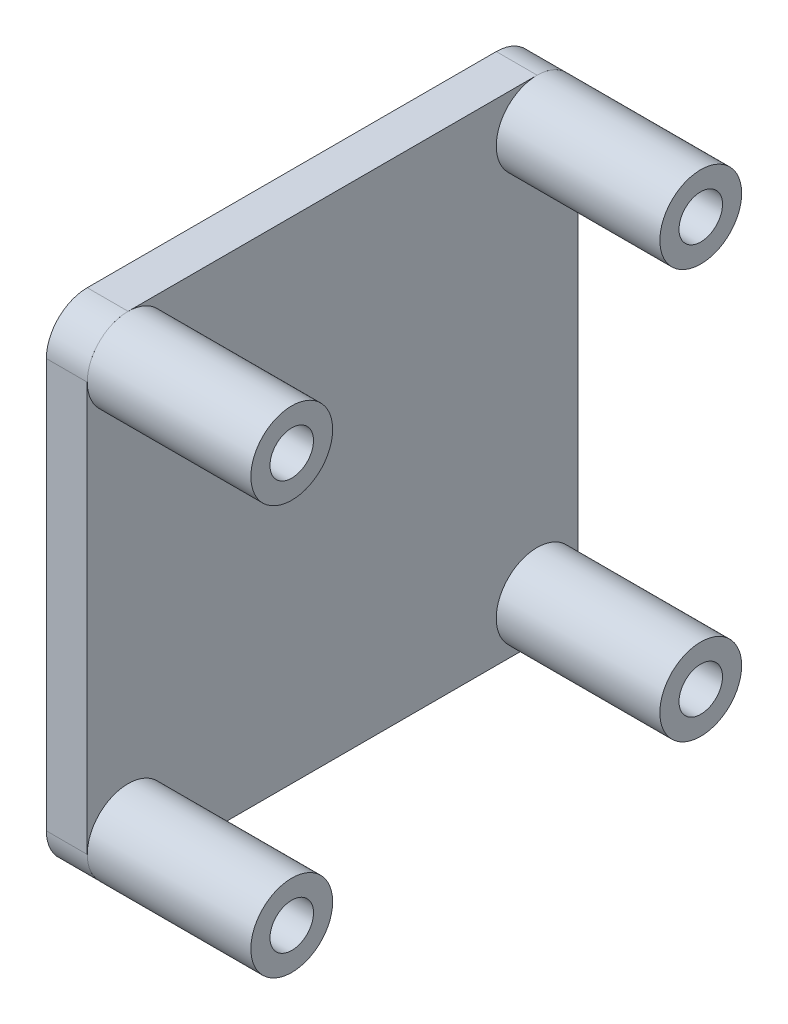
ISO-10303-21;
HEADER;
FILE_DESCRIPTION(('STEP AP214'),'2;1');
FILE_NAME('part.step','',(''),(''),'','','');
FILE_SCHEMA(('AUTOMOTIVE_DESIGN { 1 0 10303 214 1 1 1 1 }'));
ENDSEC;
DATA;
#1=APPLICATION_CONTEXT('core data for automotive mechanical design processes');
#2=APPLICATION_PROTOCOL_DEFINITION('international standard','automotive_design',2000,#1);
#3=PRODUCT_CONTEXT('',#1,'mechanical');
#4=PRODUCT('Part','Part','',(#3));
#5=PRODUCT_RELATED_PRODUCT_CATEGORY('part','',(#4));
#6=PRODUCT_DEFINITION_FORMATION('','',#4);
#7=PRODUCT_DEFINITION_CONTEXT('part definition',#1,'design');
#8=PRODUCT_DEFINITION('design','',#6,#7);
#9=PRODUCT_DEFINITION_SHAPE('','',#8);
#10=(LENGTH_UNIT() NAMED_UNIT(*) SI_UNIT(.MILLI.,.METRE.));
#11=(NAMED_UNIT(*) PLANE_ANGLE_UNIT() SI_UNIT($,.RADIAN.));
#12=(NAMED_UNIT(*) SI_UNIT($,.STERADIAN.) SOLID_ANGLE_UNIT());
#13=UNCERTAINTY_MEASURE_WITH_UNIT(LENGTH_MEASURE(1.E-05),#10,'distance_accuracy_value','');
#14=(GEOMETRIC_REPRESENTATION_CONTEXT(3) GLOBAL_UNCERTAINTY_ASSIGNED_CONTEXT((#13)) GLOBAL_UNIT_ASSIGNED_CONTEXT((#10,
#11,#12)) REPRESENTATION_CONTEXT('',''));
#15=CARTESIAN_POINT('',(0.,0.,0.));
#16=DIRECTION('',(0.,0.,1.));
#17=DIRECTION('',(1.,0.,0.));
#18=AXIS2_PLACEMENT_3D('',#15,#16,#17);
#19=CARTESIAN_POINT('',(31.75,31.75,31.75));
#20=DIRECTION('',(-1.,0.,0.));
#21=DIRECTION('',(0.,0.,1.));
#22=AXIS2_PLACEMENT_3D('',#19,#20,#21);
#23=CYLINDRICAL_SURFACE('',#22,6.35);
#24=CARTESIAN_POINT('',(31.75,31.75,31.75));
#25=DIRECTION('',(1.,0.,0.));
#26=DIRECTION('',(0.,0.,-1.));
#27=AXIS2_PLACEMENT_3D('',#24,#25,#26);
#28=CIRCLE('',#27,6.35);
#29=CARTESIAN_POINT('',(31.75,31.75,25.4));
#30=VERTEX_POINT('',#29);
#31=EDGE_CURVE('E11',#30,#30,#28,.T.);
#32=ORIENTED_EDGE('',*,*,#31,.F.);
#33=EDGE_LOOP('',(#32));
#34=FACE_BOUND('',#33,.T.);
#35=CARTESIAN_POINT('',(6.35,31.75,31.75));
#36=DIRECTION('',(1.,0.,0.));
#37=DIRECTION('',(0.,0.,-1.));
#38=AXIS2_PLACEMENT_3D('',#35,#36,#37);
#39=CIRCLE('',#38,6.35);
#40=CARTESIAN_POINT('',(6.35,31.75,25.4));
#41=VERTEX_POINT('',#40);
#42=EDGE_CURVE('E41',#41,#41,#39,.T.);
#43=ORIENTED_EDGE('',*,*,#42,.T.);
#44=EDGE_LOOP('',(#43));
#45=FACE_BOUND('',#44,.T.);
#46=ADVANCED_FACE('F38',(#34,#45),#23,.T.);
#47=CARTESIAN_POINT('',(31.75,31.75,31.75));
#48=DIRECTION('',(1.,0.,0.));
#49=DIRECTION('',(0.,0.,-1.));
#50=AXIS2_PLACEMENT_3D('',#47,#48,#49);
#51=PLANE('',#50);
#52=CARTESIAN_POINT('',(31.75,31.75,31.75));
#53=DIRECTION('',(1.,0.,0.));
#54=DIRECTION('',(0.,0.,-1.));
#55=AXIS2_PLACEMENT_3D('',#52,#53,#54);
#56=CIRCLE('',#55,3.3782);
#57=CARTESIAN_POINT('',(31.75,31.75,28.3718));
#58=VERTEX_POINT('',#57);
#59=EDGE_CURVE('E52',#58,#58,#56,.T.);
#60=ORIENTED_EDGE('',*,*,#59,.F.);
#61=EDGE_LOOP('',(#60));
#62=FACE_BOUND('',#61,.T.);
#63=ORIENTED_EDGE('',*,*,#31,.T.);
#64=EDGE_LOOP('',(#63));
#65=FACE_BOUND('',#64,.T.);
#66=ADVANCED_FACE('F59',(#62,#65),#51,.T.);
#67=CARTESIAN_POINT('',(6.35,31.75,31.75));
#68=DIRECTION('',(1.,0.,0.));
#69=DIRECTION('',(0.,0.,-1.));
#70=AXIS2_PLACEMENT_3D('',#67,#68,#69);
#71=PLANE('',#70);
#72=CARTESIAN_POINT('',(6.35,31.75,31.75));
#73=DIRECTION('',(1.,0.,0.));
#74=DIRECTION('',(0.,0.,-1.));
#75=AXIS2_PLACEMENT_3D('',#72,#73,#74);
#76=CIRCLE('',#75,3.37819999999999);
#77=CARTESIAN_POINT('',(6.35,31.75,28.3718));
#78=VERTEX_POINT('',#77);
#79=EDGE_CURVE('E48',#78,#78,#76,.T.);
#80=ORIENTED_EDGE('',*,*,#79,.T.);
#81=EDGE_LOOP('',(#80));
#82=FACE_BOUND('',#81,.T.);
#83=ORIENTED_EDGE('',*,*,#42,.F.);
#84=EDGE_LOOP('',(#83));
#85=FACE_BOUND('',#84,.T.);
#86=ADVANCED_FACE('F61',(#82,#85),#71,.F.);
#87=CARTESIAN_POINT('',(31.75,31.75,31.75));
#88=DIRECTION('',(1.,0.,0.));
#89=DIRECTION('',(0.,0.,-1.));
#90=AXIS2_PLACEMENT_3D('',#87,#88,#89);
#91=CYLINDRICAL_SURFACE('',#90,3.37819999999999);
#92=ORIENTED_EDGE('',*,*,#59,.T.);
#93=EDGE_LOOP('',(#92));
#94=FACE_BOUND('',#93,.T.);
#95=ORIENTED_EDGE('',*,*,#79,.F.);
#96=EDGE_LOOP('',(#95));
#97=FACE_BOUND('',#96,.T.);
#98=ADVANCED_FACE('F56',(#94,#97),#91,.F.);
#99=CLOSED_SHELL('',(#46,#66,#86,#98));
#100=MANIFOLD_SOLID_BREP('B2',#99);
#101=CARTESIAN_POINT('',(31.75,-31.75,31.75));
#102=DIRECTION('',(-1.,0.,0.));
#103=DIRECTION('',(0.,0.,1.));
#104=AXIS2_PLACEMENT_3D('',#101,#102,#103);
#105=CYLINDRICAL_SURFACE('',#104,6.35);
#106=CARTESIAN_POINT('',(31.75,-31.75,31.75));
#107=DIRECTION('',(1.,0.,0.));
#108=DIRECTION('',(0.,0.,-1.));
#109=AXIS2_PLACEMENT_3D('',#106,#107,#108);
#110=CIRCLE('',#109,6.35);
#111=CARTESIAN_POINT('',(31.75,-31.75,25.4));
#112=VERTEX_POINT('',#111);
#113=EDGE_CURVE('E37',#112,#112,#110,.T.);
#114=ORIENTED_EDGE('',*,*,#113,.F.);
#115=EDGE_LOOP('',(#114));
#116=FACE_BOUND('',#115,.T.);
#117=CARTESIAN_POINT('',(6.35,-31.75,31.75));
#118=DIRECTION('',(1.,0.,0.));
#119=DIRECTION('',(0.,0.,-1.));
#120=AXIS2_PLACEMENT_3D('',#117,#118,#119);
#121=CIRCLE('',#120,6.35);
#122=CARTESIAN_POINT('',(6.35,-31.75,25.4));
#123=VERTEX_POINT('',#122);
#124=EDGE_CURVE('E111',#123,#123,#121,.T.);
#125=ORIENTED_EDGE('',*,*,#124,.T.);
#126=EDGE_LOOP('',(#125));
#127=FACE_BOUND('',#126,.T.);
#128=ADVANCED_FACE('F108',(#116,#127),#105,.T.);
#129=CARTESIAN_POINT('',(31.75,-31.75,31.75));
#130=DIRECTION('',(1.,0.,0.));
#131=DIRECTION('',(0.,0.,-1.));
#132=AXIS2_PLACEMENT_3D('',#129,#130,#131);
#133=PLANE('',#132);
#134=CARTESIAN_POINT('',(31.75,-31.75,31.75));
#135=DIRECTION('',(1.,0.,0.));
#136=DIRECTION('',(0.,0.,-1.));
#137=AXIS2_PLACEMENT_3D('',#134,#135,#136);
#138=CIRCLE('',#137,3.3782);
#139=CARTESIAN_POINT('',(31.75,-31.75,28.3718));
#140=VERTEX_POINT('',#139);
#141=EDGE_CURVE('E122',#140,#140,#138,.T.);
#142=ORIENTED_EDGE('',*,*,#141,.F.);
#143=EDGE_LOOP('',(#142));
#144=FACE_BOUND('',#143,.T.);
#145=ORIENTED_EDGE('',*,*,#113,.T.);
#146=EDGE_LOOP('',(#145));
#147=FACE_BOUND('',#146,.T.);
#148=ADVANCED_FACE('F129',(#144,#147),#133,.T.);
#149=CARTESIAN_POINT('',(6.35,-31.75,31.75));
#150=DIRECTION('',(1.,0.,0.));
#151=DIRECTION('',(0.,0.,-1.));
#152=AXIS2_PLACEMENT_3D('',#149,#150,#151);
#153=PLANE('',#152);
#154=CARTESIAN_POINT('',(6.35,-31.75,31.75));
#155=DIRECTION('',(1.,0.,0.));
#156=DIRECTION('',(0.,0.,-1.));
#157=AXIS2_PLACEMENT_3D('',#154,#155,#156);
#158=CIRCLE('',#157,3.37819999999999);
#159=CARTESIAN_POINT('',(6.35,-31.75,28.3718));
#160=VERTEX_POINT('',#159);
#161=EDGE_CURVE('E118',#160,#160,#158,.T.);
#162=ORIENTED_EDGE('',*,*,#161,.T.);
#163=EDGE_LOOP('',(#162));
#164=FACE_BOUND('',#163,.T.);
#165=ORIENTED_EDGE('',*,*,#124,.F.);
#166=EDGE_LOOP('',(#165));
#167=FACE_BOUND('',#166,.T.);
#168=ADVANCED_FACE('F131',(#164,#167),#153,.F.);
#169=CARTESIAN_POINT('',(31.75,-31.75,31.75));
#170=DIRECTION('',(1.,0.,0.));
#171=DIRECTION('',(0.,0.,-1.));
#172=AXIS2_PLACEMENT_3D('',#169,#170,#171);
#173=CYLINDRICAL_SURFACE('',#172,3.37819999999999);
#174=ORIENTED_EDGE('',*,*,#141,.T.);
#175=EDGE_LOOP('',(#174));
#176=FACE_BOUND('',#175,.T.);
#177=ORIENTED_EDGE('',*,*,#161,.F.);
#178=EDGE_LOOP('',(#177));
#179=FACE_BOUND('',#178,.T.);
#180=ADVANCED_FACE('F126',(#176,#179),#173,.F.);
#181=CLOSED_SHELL('',(#128,#148,#168,#180));
#182=MANIFOLD_SOLID_BREP('B6',#181);
#183=CARTESIAN_POINT('',(31.75,-31.75,-31.75));
#184=DIRECTION('',(-1.,0.,0.));
#185=DIRECTION('',(0.,0.,1.));
#186=AXIS2_PLACEMENT_3D('',#183,#184,#185);
#187=CYLINDRICAL_SURFACE('',#186,6.35);
#188=CARTESIAN_POINT('',(31.75,-31.75,-31.75));
#189=DIRECTION('',(1.,0.,0.));
#190=DIRECTION('',(0.,0.,-1.));
#191=AXIS2_PLACEMENT_3D('',#188,#189,#190);
#192=CIRCLE('',#191,6.35);
#193=CARTESIAN_POINT('',(31.75,-31.75,-38.1));
#194=VERTEX_POINT('',#193);
#195=EDGE_CURVE('E107',#194,#194,#192,.T.);
#196=ORIENTED_EDGE('',*,*,#195,.F.);
#197=EDGE_LOOP('',(#196));
#198=FACE_BOUND('',#197,.T.);
#199=CARTESIAN_POINT('',(6.35,-31.75,-31.75));
#200=DIRECTION('',(1.,0.,0.));
#201=DIRECTION('',(0.,0.,-1.));
#202=AXIS2_PLACEMENT_3D('',#199,#200,#201);
#203=CIRCLE('',#202,6.35);
#204=CARTESIAN_POINT('',(6.35,-31.75,-38.1));
#205=VERTEX_POINT('',#204);
#206=EDGE_CURVE('E185',#205,#205,#203,.T.);
#207=ORIENTED_EDGE('',*,*,#206,.T.);
#208=EDGE_LOOP('',(#207));
#209=FACE_BOUND('',#208,.T.);
#210=ADVANCED_FACE('F178',(#198,#209),#187,.T.);
#211=CARTESIAN_POINT('',(31.75,-31.75,-31.75));
#212=DIRECTION('',(1.,0.,0.));
#213=DIRECTION('',(0.,0.,-1.));
#214=AXIS2_PLACEMENT_3D('',#211,#212,#213);
#215=PLANE('',#214);
#216=CARTESIAN_POINT('',(31.75,-31.75,-31.75));
#217=DIRECTION('',(1.,0.,0.));
#218=DIRECTION('',(0.,0.,-1.));
#219=AXIS2_PLACEMENT_3D('',#216,#217,#218);
#220=CIRCLE('',#219,3.3782);
#221=CARTESIAN_POINT('',(31.75,-31.75,-35.1282));
#222=VERTEX_POINT('',#221);
#223=EDGE_CURVE('E191',#222,#222,#220,.T.);
#224=ORIENTED_EDGE('',*,*,#223,.F.);
#225=EDGE_LOOP('',(#224));
#226=FACE_BOUND('',#225,.T.);
#227=ORIENTED_EDGE('',*,*,#195,.T.);
#228=EDGE_LOOP('',(#227));
#229=FACE_BOUND('',#228,.T.);
#230=ADVANCED_FACE('F207',(#226,#229),#215,.T.);
#231=CARTESIAN_POINT('',(6.35,-31.75,-31.75));
#232=DIRECTION('',(1.,0.,0.));
#233=DIRECTION('',(0.,0.,-1.));
#234=AXIS2_PLACEMENT_3D('',#231,#232,#233);
#235=PLANE('',#234);
#236=CARTESIAN_POINT('',(6.35,-31.75,-31.75));
#237=DIRECTION('',(1.,0.,0.));
#238=DIRECTION('',(0.,0.,-1.));
#239=AXIS2_PLACEMENT_3D('',#236,#237,#238);
#240=CIRCLE('',#239,3.37819999999999);
#241=CARTESIAN_POINT('',(6.35,-31.75,-35.1282));
#242=VERTEX_POINT('',#241);
#243=EDGE_CURVE('E181',#242,#242,#240,.T.);
#244=ORIENTED_EDGE('',*,*,#243,.T.);
#245=EDGE_LOOP('',(#244));
#246=FACE_BOUND('',#245,.T.);
#247=ORIENTED_EDGE('',*,*,#206,.F.);
#248=EDGE_LOOP('',(#247));
#249=FACE_BOUND('',#248,.T.);
#250=ADVANCED_FACE('F198',(#246,#249),#235,.F.);
#251=CARTESIAN_POINT('',(31.75,-31.75,-31.75));
#252=DIRECTION('',(1.,0.,0.));
#253=DIRECTION('',(0.,0.,-1.));
#254=AXIS2_PLACEMENT_3D('',#251,#252,#253);
#255=CYLINDRICAL_SURFACE('',#254,3.37819999999999);
#256=ORIENTED_EDGE('',*,*,#223,.T.);
#257=EDGE_LOOP('',(#256));
#258=FACE_BOUND('',#257,.T.);
#259=ORIENTED_EDGE('',*,*,#243,.F.);
#260=EDGE_LOOP('',(#259));
#261=FACE_BOUND('',#260,.T.);
#262=ADVANCED_FACE('F201',(#258,#261),#255,.F.);
#263=CLOSED_SHELL('',(#210,#230,#250,#262));
#264=MANIFOLD_SOLID_BREP('B32',#263);
#265=CARTESIAN_POINT('',(31.75,31.75,-31.75));
#266=DIRECTION('',(-1.,0.,0.));
#267=DIRECTION('',(0.,0.,1.));
#268=AXIS2_PLACEMENT_3D('',#265,#266,#267);
#269=CYLINDRICAL_SURFACE('',#268,6.35);
#270=CARTESIAN_POINT('',(31.75,31.75,-31.75));
#271=DIRECTION('',(1.,0.,0.));
#272=DIRECTION('',(0.,0.,-1.));
#273=AXIS2_PLACEMENT_3D('',#270,#271,#272);
#274=CIRCLE('',#273,6.35);
#275=CARTESIAN_POINT('',(31.75,31.75,-38.1));
#276=VERTEX_POINT('',#275);
#277=EDGE_CURVE('E177',#276,#276,#274,.T.);
#278=ORIENTED_EDGE('',*,*,#277,.F.);
#279=EDGE_LOOP('',(#278));
#280=FACE_BOUND('',#279,.T.);
#281=CARTESIAN_POINT('',(6.35,31.75,-31.75));
#282=DIRECTION('',(1.,0.,0.));
#283=DIRECTION('',(0.,0.,-1.));
#284=AXIS2_PLACEMENT_3D('',#281,#282,#283);
#285=CIRCLE('',#284,6.35);
#286=CARTESIAN_POINT('',(6.35,31.75,-38.1));
#287=VERTEX_POINT('',#286);
#288=EDGE_CURVE('E252',#287,#287,#285,.T.);
#289=ORIENTED_EDGE('',*,*,#288,.T.);
#290=EDGE_LOOP('',(#289));
#291=FACE_BOUND('',#290,.T.);
#292=ADVANCED_FACE('F249',(#280,#291),#269,.T.);
#293=CARTESIAN_POINT('',(31.75,31.75,-31.75));
#294=DIRECTION('',(1.,0.,0.));
#295=DIRECTION('',(0.,0.,-1.));
#296=AXIS2_PLACEMENT_3D('',#293,#294,#295);
#297=PLANE('',#296);
#298=CARTESIAN_POINT('',(31.75,31.75,-31.75));
#299=DIRECTION('',(1.,0.,0.));
#300=DIRECTION('',(0.,0.,-1.));
#301=AXIS2_PLACEMENT_3D('',#298,#299,#300);
#302=CIRCLE('',#301,3.3782);
#303=CARTESIAN_POINT('',(31.75,31.75,-35.1282));
#304=VERTEX_POINT('',#303);
#305=EDGE_CURVE('E263',#304,#304,#302,.T.);
#306=ORIENTED_EDGE('',*,*,#305,.F.);
#307=EDGE_LOOP('',(#306));
#308=FACE_BOUND('',#307,.T.);
#309=ORIENTED_EDGE('',*,*,#277,.T.);
#310=EDGE_LOOP('',(#309));
#311=FACE_BOUND('',#310,.T.);
#312=ADVANCED_FACE('F270',(#308,#311),#297,.T.);
#313=CARTESIAN_POINT('',(6.35,31.75,-31.75));
#314=DIRECTION('',(1.,0.,0.));
#315=DIRECTION('',(0.,0.,-1.));
#316=AXIS2_PLACEMENT_3D('',#313,#314,#315);
#317=PLANE('',#316);
#318=CARTESIAN_POINT('',(6.35,31.75,-31.75));
#319=DIRECTION('',(1.,0.,0.));
#320=DIRECTION('',(0.,0.,-1.));
#321=AXIS2_PLACEMENT_3D('',#318,#319,#320);
#322=CIRCLE('',#321,3.37819999999999);
#323=CARTESIAN_POINT('',(6.35,31.75,-35.1282));
#324=VERTEX_POINT('',#323);
#325=EDGE_CURVE('E259',#324,#324,#322,.T.);
#326=ORIENTED_EDGE('',*,*,#325,.T.);
#327=EDGE_LOOP('',(#326));
#328=FACE_BOUND('',#327,.T.);
#329=ORIENTED_EDGE('',*,*,#288,.F.);
#330=EDGE_LOOP('',(#329));
#331=FACE_BOUND('',#330,.T.);
#332=ADVANCED_FACE('F272',(#328,#331),#317,.F.);
#333=CARTESIAN_POINT('',(31.75,31.75,-31.75));
#334=DIRECTION('',(1.,0.,0.));
#335=DIRECTION('',(0.,0.,-1.));
#336=AXIS2_PLACEMENT_3D('',#333,#334,#335);
#337=CYLINDRICAL_SURFACE('',#336,3.37819999999999);
#338=ORIENTED_EDGE('',*,*,#305,.T.);
#339=EDGE_LOOP('',(#338));
#340=FACE_BOUND('',#339,.T.);
#341=ORIENTED_EDGE('',*,*,#325,.F.);
#342=EDGE_LOOP('',(#341));
#343=FACE_BOUND('',#342,.T.);
#344=ADVANCED_FACE('F267',(#340,#343),#337,.F.);
#345=CLOSED_SHELL('',(#292,#312,#332,#344));
#346=MANIFOLD_SOLID_BREP('B102',#345);
#347=CARTESIAN_POINT('',(6.35,-38.1,38.1));
#348=DIRECTION('',(0.,0.,-1.));
#349=DIRECTION('',(-1.,0.,0.));
#350=AXIS2_PLACEMENT_3D('',#347,#348,#349);
#351=PLANE('',#350);
#352=DIRECTION('',(0.,-1.,0.));
#353=VECTOR('',#352,1.);
#354=CARTESIAN_POINT('',(0.,-38.1,38.1));
#355=LINE('',#354,#353);
#356=CARTESIAN_POINT('',(0.,31.75,38.1));
#357=VERTEX_POINT('',#356);
#358=CARTESIAN_POINT('',(0.,-31.75,38.1));
#359=VERTEX_POINT('',#358);
#360=EDGE_CURVE('E407',#357,#359,#355,.T.);
#361=ORIENTED_EDGE('',*,*,#360,.T.);
#362=DIRECTION('',(-1.,0.,0.));
#363=VECTOR('',#362,1.);
#364=CARTESIAN_POINT('',(6.35,-31.75,38.1));
#365=LINE('',#364,#363);
#366=CARTESIAN_POINT('',(6.35,-31.75,38.1));
#367=VERTEX_POINT('',#366);
#368=EDGE_CURVE('E247',#359,#367,#365,.F.);
#369=ORIENTED_EDGE('',*,*,#368,.T.);
#370=DIRECTION('',(0.,-1.,0.));
#371=VECTOR('',#370,1.);
#372=CARTESIAN_POINT('',(6.35,-38.1,38.1));
#373=LINE('',#372,#371);
#374=CARTESIAN_POINT('',(6.35,31.75,38.1));
#375=VERTEX_POINT('',#374);
#376=EDGE_CURVE('E405',#375,#367,#373,.T.);
#377=ORIENTED_EDGE('',*,*,#376,.F.);
#378=DIRECTION('',(-1.,0.,0.));
#379=VECTOR('',#378,1.);
#380=CARTESIAN_POINT('',(6.35,31.75,38.1));
#381=LINE('',#380,#379);
#382=EDGE_CURVE('E319',#375,#357,#381,.T.);
#383=ORIENTED_EDGE('',*,*,#382,.T.);
#384=EDGE_LOOP('',(#361,#369,#377,#383));
#385=FACE_BOUND('',#384,.T.);
#386=ADVANCED_FACE('F311',(#385),#351,.F.);
#387=CARTESIAN_POINT('',(6.35,-38.1,-38.1));
#388=DIRECTION('',(0.,1.,0.));
#389=DIRECTION('',(0.,0.,1.));
#390=AXIS2_PLACEMENT_3D('',#387,#388,#389);
#391=PLANE('',#390);
#392=DIRECTION('',(0.,0.,-1.));
#393=VECTOR('',#392,1.);
#394=CARTESIAN_POINT('',(0.,-38.1,-38.1));
#395=LINE('',#394,#393);
#396=CARTESIAN_POINT('',(0.,-38.1,31.75));
#397=VERTEX_POINT('',#396);
#398=CARTESIAN_POINT('',(0.,-38.1,-31.75));
#399=VERTEX_POINT('',#398);
#400=EDGE_CURVE('E403',#397,#399,#395,.T.);
#401=ORIENTED_EDGE('',*,*,#400,.T.);
#402=DIRECTION('',(-1.,0.,0.));
#403=VECTOR('',#402,1.);
#404=CARTESIAN_POINT('',(6.35,-38.1,-31.75));
#405=LINE('',#404,#403);
#406=CARTESIAN_POINT('',(6.35,-38.1,-31.75));
#407=VERTEX_POINT('',#406);
#408=EDGE_CURVE('E382',#399,#407,#405,.F.);
#409=ORIENTED_EDGE('',*,*,#408,.T.);
#410=DIRECTION('',(0.,0.,-1.));
#411=VECTOR('',#410,1.);
#412=CARTESIAN_POINT('',(6.35,-38.1,-38.1));
#413=LINE('',#412,#411);
#414=CARTESIAN_POINT('',(6.35,-38.1,31.75));
#415=VERTEX_POINT('',#414);
#416=EDGE_CURVE('E447',#415,#407,#413,.T.);
#417=ORIENTED_EDGE('',*,*,#416,.F.);
#418=DIRECTION('',(-1.,0.,0.));
#419=VECTOR('',#418,1.);
#420=CARTESIAN_POINT('',(6.35,-38.1,31.75));
#421=LINE('',#420,#419);
#422=EDGE_CURVE('E387',#415,#397,#421,.T.);
#423=ORIENTED_EDGE('',*,*,#422,.T.);
#424=EDGE_LOOP('',(#401,#409,#417,#423));
#425=FACE_BOUND('',#424,.T.);
#426=ADVANCED_FACE('F486',(#425),#391,.F.);
#427=CARTESIAN_POINT('',(6.35,-38.1,-38.1));
#428=DIRECTION('',(0.,0.,1.));
#429=DIRECTION('',(1.,0.,0.));
#430=AXIS2_PLACEMENT_3D('',#427,#428,#429);
#431=PLANE('',#430);
#432=DIRECTION('',(0.,1.,0.));
#433=VECTOR('',#432,1.);
#434=CARTESIAN_POINT('',(6.35,-38.1,-38.1));
#435=LINE('',#434,#433);
#436=CARTESIAN_POINT('',(6.35,-31.75,-38.1));
#437=VERTEX_POINT('',#436);
#438=CARTESIAN_POINT('',(6.35,31.75,-38.1));
#439=VERTEX_POINT('',#438);
#440=EDGE_CURVE('E396',#437,#439,#435,.T.);
#441=ORIENTED_EDGE('',*,*,#440,.F.);
#442=DIRECTION('',(-1.,0.,0.));
#443=VECTOR('',#442,1.);
#444=CARTESIAN_POINT('',(6.35,-31.75,-38.1));
#445=LINE('',#444,#443);
#446=CARTESIAN_POINT('',(0.,-31.75,-38.1));
#447=VERTEX_POINT('',#446);
#448=EDGE_CURVE('E381',#437,#447,#445,.T.);
#449=ORIENTED_EDGE('',*,*,#448,.T.);
#450=DIRECTION('',(0.,1.,0.));
#451=VECTOR('',#450,1.);
#452=CARTESIAN_POINT('',(0.,-38.1,-38.1));
#453=LINE('',#452,#451);
#454=CARTESIAN_POINT('',(0.,31.75,-38.1));
#455=VERTEX_POINT('',#454);
#456=EDGE_CURVE('E394',#447,#455,#453,.T.);
#457=ORIENTED_EDGE('',*,*,#456,.T.);
#458=DIRECTION('',(-1.,0.,0.));
#459=VECTOR('',#458,1.);
#460=CARTESIAN_POINT('',(6.35,31.75,-38.1));
#461=LINE('',#460,#459);
#462=EDGE_CURVE('E398',#455,#439,#461,.F.);
#463=ORIENTED_EDGE('',*,*,#462,.T.);
#464=EDGE_LOOP('',(#441,#449,#457,#463));
#465=FACE_BOUND('',#464,.T.);
#466=ADVANCED_FACE('F393',(#465),#431,.F.);
#467=CARTESIAN_POINT('',(6.35,38.1,-38.1));
#468=DIRECTION('',(0.,-1.,0.));
#469=DIRECTION('',(0.,0.,-1.));
#470=AXIS2_PLACEMENT_3D('',#467,#468,#469);
#471=PLANE('',#470);
#472=DIRECTION('',(0.,0.,1.));
#473=VECTOR('',#472,1.);
#474=CARTESIAN_POINT('',(6.35,38.1,-38.1));
#475=LINE('',#474,#473);
#476=CARTESIAN_POINT('',(6.35,38.1,-31.75));
#477=VERTEX_POINT('',#476);
#478=CARTESIAN_POINT('',(6.35,38.1,31.75));
#479=VERTEX_POINT('',#478);
#480=EDGE_CURVE('E411',#477,#479,#475,.T.);
#481=ORIENTED_EDGE('',*,*,#480,.F.);
#482=DIRECTION('',(-1.,0.,0.));
#483=VECTOR('',#482,1.);
#484=CARTESIAN_POINT('',(6.35,38.1,-31.75));
#485=LINE('',#484,#483);
#486=CARTESIAN_POINT('',(0.,38.1,-31.75));
#487=VERTEX_POINT('',#486);
#488=EDGE_CURVE('E428',#477,#487,#485,.T.);
#489=ORIENTED_EDGE('',*,*,#488,.T.);
#490=DIRECTION('',(0.,0.,1.));
#491=VECTOR('',#490,1.);
#492=CARTESIAN_POINT('',(0.,38.1,-38.1));
#493=LINE('',#492,#491);
#494=CARTESIAN_POINT('',(0.,38.1,31.75));
#495=VERTEX_POINT('',#494);
#496=EDGE_CURVE('E402',#487,#495,#493,.T.);
#497=ORIENTED_EDGE('',*,*,#496,.T.);
#498=DIRECTION('',(-1.,0.,0.));
#499=VECTOR('',#498,1.);
#500=CARTESIAN_POINT('',(6.35,38.1,31.75));
#501=LINE('',#500,#499);
#502=EDGE_CURVE('E326',#495,#479,#501,.F.);
#503=ORIENTED_EDGE('',*,*,#502,.T.);
#504=EDGE_LOOP('',(#481,#489,#497,#503));
#505=FACE_BOUND('',#504,.T.);
#506=ADVANCED_FACE('F512',(#505),#471,.F.);
#507=CARTESIAN_POINT('',(6.35,38.1,38.1));
#508=DIRECTION('',(1.,0.,0.));
#509=DIRECTION('',(0.,0.,-1.));
#510=AXIS2_PLACEMENT_3D('',#507,#508,#509);
#511=PLANE('',#510);
#512=CARTESIAN_POINT('',(6.35,31.75,-31.75));
#513=DIRECTION('',(1.,0.,0.));
#514=DIRECTION('',(0.,0.,-1.));
#515=AXIS2_PLACEMENT_3D('',#512,#513,#514);
#516=CIRCLE('',#515,3.37819999999999);
#517=CARTESIAN_POINT('',(6.35,31.75,-35.1282));
#518=VERTEX_POINT('',#517);
#519=EDGE_CURVE('E465',#518,#518,#516,.T.);
#520=ORIENTED_EDGE('',*,*,#519,.F.);
#521=EDGE_LOOP('',(#520));
#522=FACE_BOUND('',#521,.T.);
#523=CARTESIAN_POINT('',(6.35,-31.75,31.75));
#524=DIRECTION('',(1.,0.,0.));
#525=DIRECTION('',(0.,0.,-1.));
#526=AXIS2_PLACEMENT_3D('',#523,#524,#525);
#527=CIRCLE('',#526,3.37819999999999);
#528=CARTESIAN_POINT('',(6.35,-31.75,28.3718));
#529=VERTEX_POINT('',#528);
#530=EDGE_CURVE('E459',#529,#529,#527,.T.);
#531=ORIENTED_EDGE('',*,*,#530,.F.);
#532=EDGE_LOOP('',(#531));
#533=FACE_BOUND('',#532,.T.);
#534=CARTESIAN_POINT('',(6.35,31.75,31.75));
#535=DIRECTION('',(1.,0.,0.));
#536=DIRECTION('',(0.,0.,-1.));
#537=AXIS2_PLACEMENT_3D('',#534,#535,#536);
#538=CIRCLE('',#537,3.37819999999999);
#539=CARTESIAN_POINT('',(6.35,31.75,28.3718));
#540=VERTEX_POINT('',#539);
#541=EDGE_CURVE('E453',#540,#540,#538,.T.);
#542=ORIENTED_EDGE('',*,*,#541,.F.);
#543=EDGE_LOOP('',(#542));
#544=FACE_BOUND('',#543,.T.);
#545=CARTESIAN_POINT('',(6.35,-31.75,-31.75));
#546=DIRECTION('',(1.,0.,0.));
#547=DIRECTION('',(0.,0.,-1.));
#548=AXIS2_PLACEMENT_3D('',#545,#546,#547);
#549=CIRCLE('',#548,3.37819999999999);
#550=CARTESIAN_POINT('',(6.35,-31.75,-35.1282));
#551=VERTEX_POINT('',#550);
#552=EDGE_CURVE('E440',#551,#551,#549,.T.);
#553=ORIENTED_EDGE('',*,*,#552,.F.);
#554=EDGE_LOOP('',(#553));
#555=FACE_BOUND('',#554,.T.);
#556=ORIENTED_EDGE('',*,*,#416,.T.);
#557=CARTESIAN_POINT('',(6.35,-31.75,-31.75));
#558=DIRECTION('',(1.,0.,0.));
#559=DIRECTION('',(0.,0.,-1.));
#560=AXIS2_PLACEMENT_3D('',#557,#558,#559);
#561=CIRCLE('',#560,6.35);
#562=EDGE_CURVE('E425',#407,#437,#561,.T.);
#563=ORIENTED_EDGE('',*,*,#562,.T.);
#564=ORIENTED_EDGE('',*,*,#440,.T.);
#565=CARTESIAN_POINT('',(6.35,31.75,-31.75));
#566=DIRECTION('',(1.,0.,0.));
#567=DIRECTION('',(0.,0.,-1.));
#568=AXIS2_PLACEMENT_3D('',#565,#566,#567);
#569=CIRCLE('',#568,6.35);
#570=EDGE_CURVE('E333',#439,#477,#569,.T.);
#571=ORIENTED_EDGE('',*,*,#570,.T.);
#572=ORIENTED_EDGE('',*,*,#480,.T.);
#573=CARTESIAN_POINT('',(6.35,31.75,31.75));
#574=DIRECTION('',(1.,0.,0.));
#575=DIRECTION('',(0.,0.,-1.));
#576=AXIS2_PLACEMENT_3D('',#573,#574,#575);
#577=CIRCLE('',#576,6.35);
#578=EDGE_CURVE('E420',#479,#375,#577,.T.);
#579=ORIENTED_EDGE('',*,*,#578,.T.);
#580=ORIENTED_EDGE('',*,*,#376,.T.);
#581=CARTESIAN_POINT('',(6.35,-31.75,31.75));
#582=DIRECTION('',(1.,0.,0.));
#583=DIRECTION('',(0.,0.,-1.));
#584=AXIS2_PLACEMENT_3D('',#581,#582,#583);
#585=CIRCLE('',#584,6.35);
#586=EDGE_CURVE('E422',#367,#415,#585,.T.);
#587=ORIENTED_EDGE('',*,*,#586,.T.);
#588=EDGE_LOOP('',(#556,#563,#564,#571,#572,#579,#580,#587));
#589=FACE_BOUND('',#588,.T.);
#590=ADVANCED_FACE('F510',(#522,#533,#544,#555,#589),#511,.T.);
#591=CARTESIAN_POINT('',(0.,38.1,38.1));
#592=DIRECTION('',(1.,0.,0.));
#593=DIRECTION('',(0.,0.,-1.));
#594=AXIS2_PLACEMENT_3D('',#591,#592,#593);
#595=PLANE('',#594);
#596=CARTESIAN_POINT('',(0.,31.75,-31.75));
#597=DIRECTION('',(1.,0.,0.));
#598=DIRECTION('',(0.,0.,-1.));
#599=AXIS2_PLACEMENT_3D('',#596,#597,#598);
#600=CIRCLE('',#599,3.37819999999999);
#601=CARTESIAN_POINT('',(0.,31.75,-35.1282));
#602=VERTEX_POINT('',#601);
#603=EDGE_CURVE('E468',#602,#602,#600,.T.);
#604=ORIENTED_EDGE('',*,*,#603,.T.);
#605=EDGE_LOOP('',(#604));
#606=FACE_BOUND('',#605,.T.);
#607=CARTESIAN_POINT('',(0.,-31.75,31.75));
#608=DIRECTION('',(1.,0.,0.));
#609=DIRECTION('',(0.,0.,-1.));
#610=AXIS2_PLACEMENT_3D('',#607,#608,#609);
#611=CIRCLE('',#610,3.37819999999999);
#612=CARTESIAN_POINT('',(0.,-31.75,28.3718));
#613=VERTEX_POINT('',#612);
#614=EDGE_CURVE('E462',#613,#613,#611,.T.);
#615=ORIENTED_EDGE('',*,*,#614,.T.);
#616=EDGE_LOOP('',(#615));
#617=FACE_BOUND('',#616,.T.);
#618=CARTESIAN_POINT('',(0.,31.75,31.75));
#619=DIRECTION('',(1.,0.,0.));
#620=DIRECTION('',(0.,0.,-1.));
#621=AXIS2_PLACEMENT_3D('',#618,#619,#620);
#622=CIRCLE('',#621,3.37819999999999);
#623=CARTESIAN_POINT('',(0.,31.75,28.3718));
#624=VERTEX_POINT('',#623);
#625=EDGE_CURVE('E456',#624,#624,#622,.T.);
#626=ORIENTED_EDGE('',*,*,#625,.T.);
#627=EDGE_LOOP('',(#626));
#628=FACE_BOUND('',#627,.T.);
#629=CARTESIAN_POINT('',(0.,-31.75,-31.75));
#630=DIRECTION('',(1.,0.,0.));
#631=DIRECTION('',(0.,0.,-1.));
#632=AXIS2_PLACEMENT_3D('',#629,#630,#631);
#633=CIRCLE('',#632,3.37819999999999);
#634=CARTESIAN_POINT('',(0.,-31.75,-35.1282));
#635=VERTEX_POINT('',#634);
#636=EDGE_CURVE('E442',#635,#635,#633,.T.);
#637=ORIENTED_EDGE('',*,*,#636,.T.);
#638=EDGE_LOOP('',(#637));
#639=FACE_BOUND('',#638,.T.);
#640=ORIENTED_EDGE('',*,*,#456,.F.);
#641=CARTESIAN_POINT('',(0.,-31.75,-31.75));
#642=DIRECTION('',(1.,0.,0.));
#643=DIRECTION('',(0.,0.,-1.));
#644=AXIS2_PLACEMENT_3D('',#641,#642,#643);
#645=CIRCLE('',#644,6.35);
#646=EDGE_CURVE('E377',#447,#399,#645,.F.);
#647=ORIENTED_EDGE('',*,*,#646,.T.);
#648=ORIENTED_EDGE('',*,*,#400,.F.);
#649=CARTESIAN_POINT('',(0.,-31.75,31.75));
#650=DIRECTION('',(1.,0.,0.));
#651=DIRECTION('',(0.,0.,-1.));
#652=AXIS2_PLACEMENT_3D('',#649,#650,#651);
#653=CIRCLE('',#652,6.35);
#654=EDGE_CURVE('E414',#397,#359,#653,.F.);
#655=ORIENTED_EDGE('',*,*,#654,.T.);
#656=ORIENTED_EDGE('',*,*,#360,.F.);
#657=CARTESIAN_POINT('',(0.,31.75,31.75));
#658=DIRECTION('',(1.,0.,0.));
#659=DIRECTION('',(0.,0.,-1.));
#660=AXIS2_PLACEMENT_3D('',#657,#658,#659);
#661=CIRCLE('',#660,6.35);
#662=EDGE_CURVE('E397',#357,#495,#661,.F.);
#663=ORIENTED_EDGE('',*,*,#662,.T.);
#664=ORIENTED_EDGE('',*,*,#496,.F.);
#665=CARTESIAN_POINT('',(0.,31.75,-31.75));
#666=DIRECTION('',(1.,0.,0.));
#667=DIRECTION('',(0.,0.,-1.));
#668=AXIS2_PLACEMENT_3D('',#665,#666,#667);
#669=CIRCLE('',#668,6.35);
#670=EDGE_CURVE('E388',#487,#455,#669,.F.);
#671=ORIENTED_EDGE('',*,*,#670,.T.);
#672=EDGE_LOOP('',(#640,#647,#648,#655,#656,#663,#664,#671));
#673=FACE_BOUND('',#672,.T.);
#674=ADVANCED_FACE('F400',(#606,#617,#628,#639,#673),#595,.F.);
#675=CARTESIAN_POINT('',(6.35,-31.75,-31.75));
#676=DIRECTION('',(-1.,0.,0.));
#677=DIRECTION('',(0.,0.,1.));
#678=AXIS2_PLACEMENT_3D('',#675,#676,#677);
#679=CYLINDRICAL_SURFACE('',#678,6.35);
#680=ORIENTED_EDGE('',*,*,#562,.F.);
#681=ORIENTED_EDGE('',*,*,#408,.F.);
#682=ORIENTED_EDGE('',*,*,#646,.F.);
#683=ORIENTED_EDGE('',*,*,#448,.F.);
#684=EDGE_LOOP('',(#680,#681,#682,#683));
#685=FACE_BOUND('',#684,.T.);
#686=ADVANCED_FACE('F380',(#685),#679,.T.);
#687=CARTESIAN_POINT('',(6.35,31.75,-31.75));
#688=DIRECTION('',(-1.,0.,0.));
#689=DIRECTION('',(0.,0.,1.));
#690=AXIS2_PLACEMENT_3D('',#687,#688,#689);
#691=CYLINDRICAL_SURFACE('',#690,6.35);
#692=ORIENTED_EDGE('',*,*,#570,.F.);
#693=ORIENTED_EDGE('',*,*,#462,.F.);
#694=ORIENTED_EDGE('',*,*,#670,.F.);
#695=ORIENTED_EDGE('',*,*,#488,.F.);
#696=EDGE_LOOP('',(#692,#693,#694,#695));
#697=FACE_BOUND('',#696,.T.);
#698=ADVANCED_FACE('F497',(#697),#691,.T.);
#699=CARTESIAN_POINT('',(6.35,-31.75,31.75));
#700=DIRECTION('',(-1.,0.,0.));
#701=DIRECTION('',(0.,0.,1.));
#702=AXIS2_PLACEMENT_3D('',#699,#700,#701);
#703=CYLINDRICAL_SURFACE('',#702,6.35);
#704=ORIENTED_EDGE('',*,*,#586,.F.);
#705=ORIENTED_EDGE('',*,*,#368,.F.);
#706=ORIENTED_EDGE('',*,*,#654,.F.);
#707=ORIENTED_EDGE('',*,*,#422,.F.);
#708=EDGE_LOOP('',(#704,#705,#706,#707));
#709=FACE_BOUND('',#708,.T.);
#710=ADVANCED_FACE('F499',(#709),#703,.T.);
#711=CARTESIAN_POINT('',(6.35,31.75,31.75));
#712=DIRECTION('',(-1.,0.,0.));
#713=DIRECTION('',(0.,0.,1.));
#714=AXIS2_PLACEMENT_3D('',#711,#712,#713);
#715=CYLINDRICAL_SURFACE('',#714,6.35);
#716=ORIENTED_EDGE('',*,*,#578,.F.);
#717=ORIENTED_EDGE('',*,*,#502,.F.);
#718=ORIENTED_EDGE('',*,*,#662,.F.);
#719=ORIENTED_EDGE('',*,*,#382,.F.);
#720=EDGE_LOOP('',(#716,#717,#718,#719));
#721=FACE_BOUND('',#720,.T.);
#722=ADVANCED_FACE('F313',(#721),#715,.T.);
#723=CARTESIAN_POINT('',(31.75,-31.75,-31.75));
#724=DIRECTION('',(1.,0.,0.));
#725=DIRECTION('',(0.,0.,-1.));
#726=AXIS2_PLACEMENT_3D('',#723,#724,#725);
#727=CYLINDRICAL_SURFACE('',#726,3.37819999999999);
#728=ORIENTED_EDGE('',*,*,#552,.T.);
#729=EDGE_LOOP('',(#728));
#730=FACE_BOUND('',#729,.T.);
#731=ORIENTED_EDGE('',*,*,#636,.F.);
#732=EDGE_LOOP('',(#731));
#733=FACE_BOUND('',#732,.T.);
#734=ADVANCED_FACE('F506',(#730,#733),#727,.F.);
#735=CARTESIAN_POINT('',(31.75,31.75,31.75));
#736=DIRECTION('',(1.,0.,0.));
#737=DIRECTION('',(0.,0.,-1.));
#738=AXIS2_PLACEMENT_3D('',#735,#736,#737);
#739=CYLINDRICAL_SURFACE('',#738,3.37819999999999);
#740=ORIENTED_EDGE('',*,*,#541,.T.);
#741=EDGE_LOOP('',(#740));
#742=FACE_BOUND('',#741,.T.);
#743=ORIENTED_EDGE('',*,*,#625,.F.);
#744=EDGE_LOOP('',(#743));
#745=FACE_BOUND('',#744,.T.);
#746=ADVANCED_FACE('F482',(#742,#745),#739,.F.);
#747=CARTESIAN_POINT('',(31.75,-31.75,31.75));
#748=DIRECTION('',(1.,0.,0.));
#749=DIRECTION('',(0.,0.,-1.));
#750=AXIS2_PLACEMENT_3D('',#747,#748,#749);
#751=CYLINDRICAL_SURFACE('',#750,3.37819999999999);
#752=ORIENTED_EDGE('',*,*,#530,.T.);
#753=EDGE_LOOP('',(#752));
#754=FACE_BOUND('',#753,.T.);
#755=ORIENTED_EDGE('',*,*,#614,.F.);
#756=EDGE_LOOP('',(#755));
#757=FACE_BOUND('',#756,.T.);
#758=ADVANCED_FACE('F476',(#754,#757),#751,.F.);
#759=CARTESIAN_POINT('',(31.75,31.75,-31.75));
#760=DIRECTION('',(1.,0.,0.));
#761=DIRECTION('',(0.,0.,-1.));
#762=AXIS2_PLACEMENT_3D('',#759,#760,#761);
#763=CYLINDRICAL_SURFACE('',#762,3.37819999999999);
#764=ORIENTED_EDGE('',*,*,#519,.T.);
#765=EDGE_LOOP('',(#764));
#766=FACE_BOUND('',#765,.T.);
#767=ORIENTED_EDGE('',*,*,#603,.F.);
#768=EDGE_LOOP('',(#767));
#769=FACE_BOUND('',#768,.T.);
#770=ADVANCED_FACE('F474',(#766,#769),#763,.F.);
#771=CLOSED_SHELL('',(#386,#426,#466,#506,#590,#674,#686,#698,#710,#722,#734,#746,#758,#770));
#772=MANIFOLD_SOLID_BREP('B172',#771);
#773=ADVANCED_BREP_SHAPE_REPRESENTATION('',(#18,#100,#182,#264,#346,#772),#14);
#774=SHAPE_DEFINITION_REPRESENTATION(#9,#773);
ENDSEC;
END-ISO-10303-21;
